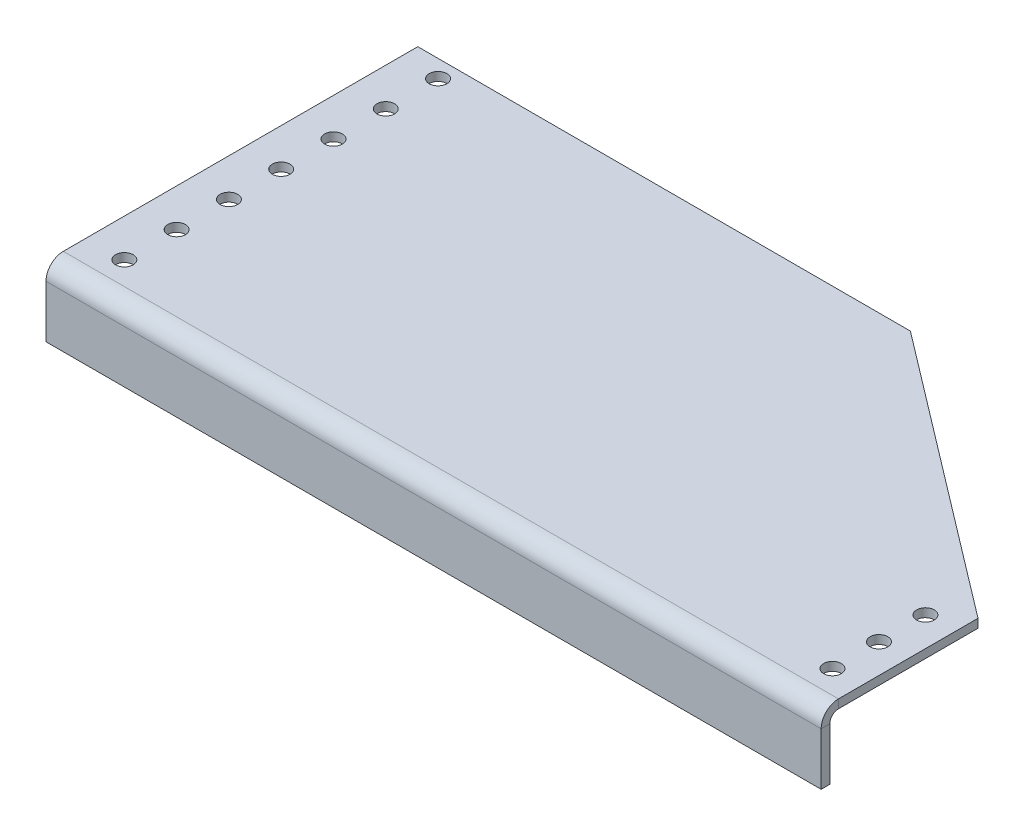
ISO-10303-21;
HEADER;
FILE_DESCRIPTION(('STEP AP214'),'2;1');
FILE_NAME('part.step','',(''),(''),'','','');
FILE_SCHEMA(('AUTOMOTIVE_DESIGN { 1 0 10303 214 1 1 1 1 }'));
ENDSEC;
DATA;
#1=APPLICATION_CONTEXT('core data for automotive mechanical design processes');
#2=APPLICATION_PROTOCOL_DEFINITION('international standard','automotive_design',2000,#1);
#3=PRODUCT_CONTEXT('',#1,'mechanical');
#4=PRODUCT('Part','Part','',(#3));
#5=PRODUCT_RELATED_PRODUCT_CATEGORY('part','',(#4));
#6=PRODUCT_DEFINITION_FORMATION('','',#4);
#7=PRODUCT_DEFINITION_CONTEXT('part definition',#1,'design');
#8=PRODUCT_DEFINITION('design','',#6,#7);
#9=PRODUCT_DEFINITION_SHAPE('','',#8);
#10=(LENGTH_UNIT() NAMED_UNIT(*) SI_UNIT(.MILLI.,.METRE.));
#11=(NAMED_UNIT(*) PLANE_ANGLE_UNIT() SI_UNIT($,.RADIAN.));
#12=(NAMED_UNIT(*) SI_UNIT($,.STERADIAN.) SOLID_ANGLE_UNIT());
#13=UNCERTAINTY_MEASURE_WITH_UNIT(LENGTH_MEASURE(1.E-05),#10,'distance_accuracy_value','');
#14=(GEOMETRIC_REPRESENTATION_CONTEXT(3) GLOBAL_UNCERTAINTY_ASSIGNED_CONTEXT((#13)) GLOBAL_UNIT_ASSIGNED_CONTEXT((#10,
#11,#12)) REPRESENTATION_CONTEXT('',''));
#15=CARTESIAN_POINT('',(0.,0.,0.));
#16=DIRECTION('',(0.,0.,1.));
#17=DIRECTION('',(1.,0.,0.));
#18=AXIS2_PLACEMENT_3D('',#15,#16,#17);
#19=CARTESIAN_POINT('',(-105.918,-2.3622,87.757));
#20=DIRECTION('',(-1.,0.,0.));
#21=DIRECTION('',(0.,0.,1.));
#22=AXIS2_PLACEMENT_3D('',#19,#20,#21);
#23=PLANE('',#22);
#24=DIRECTION('',(0.,0.,1.));
#25=VECTOR('',#24,1.);
#26=CARTESIAN_POINT('',(-105.918,0.,87.757));
#27=LINE('',#26,#25);
#28=CARTESIAN_POINT('',(-105.918,0.,-11.4808000000001));
#29=VERTEX_POINT('',#28);
#30=CARTESIAN_POINT('',(-105.918,0.,85.397));
#31=VERTEX_POINT('',#30);
#32=EDGE_CURVE('E193',#29,#31,#27,.T.);
#33=ORIENTED_EDGE('',*,*,#32,.F.);
#34=DIRECTION('',(0.,-1.,0.));
#35=VECTOR('',#34,1.);
#36=CARTESIAN_POINT('',(-105.918,0.,-11.4808000000001));
#37=LINE('',#36,#35);
#38=CARTESIAN_POINT('',(-105.918,-2.3622,-11.4808000000001));
#39=VERTEX_POINT('',#38);
#40=EDGE_CURVE('E121',#29,#39,#37,.T.);
#41=ORIENTED_EDGE('',*,*,#40,.T.);
#42=DIRECTION('',(0.,0.,1.));
#43=VECTOR('',#42,1.);
#44=CARTESIAN_POINT('',(-105.918,-2.3622,87.757));
#45=LINE('',#44,#43);
#46=CARTESIAN_POINT('',(-105.918,-2.36219999999999,85.397));
#47=VERTEX_POINT('',#46);
#48=EDGE_CURVE('E51',#39,#47,#45,.T.);
#49=ORIENTED_EDGE('',*,*,#48,.T.);
#50=DIRECTION('',(0.,1.,0.));
#51=VECTOR('',#50,1.);
#52=CARTESIAN_POINT('',(-105.918,-2.36219999999999,85.397));
#53=LINE('',#52,#51);
#54=EDGE_CURVE('E181',#47,#31,#53,.T.);
#55=ORIENTED_EDGE('',*,*,#54,.T.);
#56=EDGE_LOOP('',(#33,#41,#49,#55));
#57=FACE_BOUND('',#56,.T.);
#58=ADVANCED_FACE('F43',(#57),#23,.T.);
#59=CARTESIAN_POINT('',(0.,-2.3622,0.));
#60=DIRECTION('',(0.,1.,0.));
#61=DIRECTION('',(0.,0.,1.));
#62=AXIS2_PLACEMENT_3D('',#59,#60,#61);
#63=PLANE('',#62);
#64=CARTESIAN_POINT('',(-95.5801999999981,-2.3622,79.0469999999999));
#65=DIRECTION('',(0.,-1.,0.));
#66=DIRECTION('',(0.,0.,-1.));
#67=AXIS2_PLACEMENT_3D('',#64,#65,#66);
#68=CIRCLE('',#67,2.41299999999999);
#69=CARTESIAN_POINT('',(-95.5801999999981,-2.3622,76.6339999999999));
#70=VERTEX_POINT('',#69);
#71=EDGE_CURVE('E313',#70,#70,#68,.T.);
#72=ORIENTED_EDGE('',*,*,#71,.F.);
#73=EDGE_LOOP('',(#72));
#74=FACE_BOUND('',#73,.T.);
#75=CARTESIAN_POINT('',(-95.580199999998,-2.3622,64.7594999999999));
#76=DIRECTION('',(0.,-1.,0.));
#77=DIRECTION('',(0.,0.,-1.));
#78=AXIS2_PLACEMENT_3D('',#75,#76,#77);
#79=CIRCLE('',#78,2.41299999999999);
#80=CARTESIAN_POINT('',(-95.580199999998,-2.3622,62.3464999999999));
#81=VERTEX_POINT('',#80);
#82=EDGE_CURVE('E314',#81,#81,#79,.T.);
#83=ORIENTED_EDGE('',*,*,#82,.F.);
#84=EDGE_LOOP('',(#83));
#85=FACE_BOUND('',#84,.T.);
#86=CARTESIAN_POINT('',(-95.5801999999978,-2.3622,50.4719999999999));
#87=DIRECTION('',(0.,-1.,0.));
#88=DIRECTION('',(0.,0.,-1.));
#89=AXIS2_PLACEMENT_3D('',#86,#87,#88);
#90=CIRCLE('',#89,2.41299999999999);
#91=CARTESIAN_POINT('',(-95.5801999999978,-2.3622,48.0589999999999));
#92=VERTEX_POINT('',#91);
#93=EDGE_CURVE('E323',#92,#92,#90,.T.);
#94=ORIENTED_EDGE('',*,*,#93,.F.);
#95=EDGE_LOOP('',(#94));
#96=FACE_BOUND('',#95,.T.);
#97=CARTESIAN_POINT('',(-95.5801999999977,-2.3622,36.1845));
#98=DIRECTION('',(0.,-1.,0.));
#99=DIRECTION('',(0.,0.,-1.));
#100=AXIS2_PLACEMENT_3D('',#97,#98,#99);
#101=CIRCLE('',#100,2.41299999999999);
#102=CARTESIAN_POINT('',(-95.5801999999977,-2.3622,33.7715));
#103=VERTEX_POINT('',#102);
#104=EDGE_CURVE('E329',#103,#103,#101,.T.);
#105=ORIENTED_EDGE('',*,*,#104,.F.);
#106=EDGE_LOOP('',(#105));
#107=FACE_BOUND('',#106,.T.);
#108=CARTESIAN_POINT('',(-95.5801999999975,-2.3622,21.8969999999999));
#109=DIRECTION('',(0.,-1.,0.));
#110=DIRECTION('',(0.,0.,-1.));
#111=AXIS2_PLACEMENT_3D('',#108,#109,#110);
#112=CIRCLE('',#111,2.413);
#113=CARTESIAN_POINT('',(-95.5801999999975,-2.3622,19.4839999999999));
#114=VERTEX_POINT('',#113);
#115=EDGE_CURVE('E335',#114,#114,#112,.T.);
#116=ORIENTED_EDGE('',*,*,#115,.F.);
#117=EDGE_LOOP('',(#116));
#118=FACE_BOUND('',#117,.T.);
#119=CARTESIAN_POINT('',(-95.5801999999974,-2.3622,7.60949999999994));
#120=DIRECTION('',(0.,-1.,0.));
#121=DIRECTION('',(0.,0.,-1.));
#122=AXIS2_PLACEMENT_3D('',#119,#120,#121);
#123=CIRCLE('',#122,2.41299999999999);
#124=CARTESIAN_POINT('',(-95.5801999999974,-2.3622,5.19649999999994));
#125=VERTEX_POINT('',#124);
#126=EDGE_CURVE('E341',#125,#125,#123,.T.);
#127=ORIENTED_EDGE('',*,*,#126,.F.);
#128=EDGE_LOOP('',(#127));
#129=FACE_BOUND('',#128,.T.);
#130=CARTESIAN_POINT('',(-95.5801999999972,-2.3622,-6.67800000000007));
#131=DIRECTION('',(0.,-1.,0.));
#132=DIRECTION('',(0.,0.,-1.));
#133=AXIS2_PLACEMENT_3D('',#130,#131,#132);
#134=CIRCLE('',#133,2.413);
#135=CARTESIAN_POINT('',(-95.5801999999972,-2.3622,-9.09100000000007));
#136=VERTEX_POINT('',#135);
#137=EDGE_CURVE('E347',#136,#136,#134,.T.);
#138=ORIENTED_EDGE('',*,*,#137,.F.);
#139=EDGE_LOOP('',(#138));
#140=FACE_BOUND('',#139,.T.);
#141=CARTESIAN_POINT('',(97.9402000000013,-2.3622,79.0469999999996));
#142=DIRECTION('',(0.,-1.,0.));
#143=DIRECTION('',(0.,0.,-1.));
#144=AXIS2_PLACEMENT_3D('',#141,#142,#143);
#145=CIRCLE('',#144,2.41299999999999);
#146=CARTESIAN_POINT('',(97.9402000000013,-2.3622,76.6339999999996));
#147=VERTEX_POINT('',#146);
#148=EDGE_CURVE('E355',#147,#147,#145,.T.);
#149=ORIENTED_EDGE('',*,*,#148,.F.);
#150=EDGE_LOOP('',(#149));
#151=FACE_BOUND('',#150,.T.);
#152=CARTESIAN_POINT('',(97.9402000000013,-2.3622,66.3469999999995));
#153=DIRECTION('',(0.,-1.,0.));
#154=DIRECTION('',(0.,0.,-1.));
#155=AXIS2_PLACEMENT_3D('',#152,#153,#154);
#156=CIRCLE('',#155,2.41299999999999);
#157=CARTESIAN_POINT('',(97.9402000000013,-2.3622,63.9339999999995));
#158=VERTEX_POINT('',#157);
#159=EDGE_CURVE('E358',#158,#158,#156,.T.);
#160=ORIENTED_EDGE('',*,*,#159,.F.);
#161=EDGE_LOOP('',(#160));
#162=FACE_BOUND('',#161,.T.);
#163=CARTESIAN_POINT('',(97.9402000000013,-2.3622,53.6469999999993));
#164=DIRECTION('',(0.,-1.,0.));
#165=DIRECTION('',(0.,0.,-1.));
#166=AXIS2_PLACEMENT_3D('',#163,#164,#165);
#167=CIRCLE('',#166,2.41299999999999);
#168=CARTESIAN_POINT('',(97.9402000000013,-2.3622,51.2339999999993));
#169=VERTEX_POINT('',#168);
#170=EDGE_CURVE('E363',#169,#169,#167,.T.);
#171=ORIENTED_EDGE('',*,*,#170,.F.);
#172=EDGE_LOOP('',(#171));
#173=FACE_BOUND('',#172,.T.);
#174=DIRECTION('',(0.795897255995404,0.,0.605431712003084));
#175=VECTOR('',#174,1.);
#176=CARTESIAN_POINT('',(16.0528028073742,-2.3622,-21.102927798667));
#177=LINE('',#176,#175);
#178=CARTESIAN_POINT('',(28.702,-2.3622,-11.4808000000001));
#179=VERTEX_POINT('',#178);
#180=CARTESIAN_POINT('',(105.918,-2.3622,47.2567000000001));
#181=VERTEX_POINT('',#180);
#182=EDGE_CURVE('E127',#179,#181,#177,.T.);
#183=ORIENTED_EDGE('',*,*,#182,.T.);
#184=DIRECTION('',(0.,0.,-1.));
#185=VECTOR('',#184,1.);
#186=CARTESIAN_POINT('',(105.918,-2.3622,87.757));
#187=LINE('',#186,#185);
#188=CARTESIAN_POINT('',(105.918,-2.36219999999999,85.397));
#189=VERTEX_POINT('',#188);
#190=EDGE_CURVE('E11',#189,#181,#187,.T.);
#191=ORIENTED_EDGE('',*,*,#190,.F.);
#192=DIRECTION('',(-1.,0.,0.));
#193=VECTOR('',#192,1.);
#194=CARTESIAN_POINT('',(-105.918,-2.36219999999999,85.397));
#195=LINE('',#194,#193);
#196=EDGE_CURVE('E187',#47,#189,#195,.F.);
#197=ORIENTED_EDGE('',*,*,#196,.F.);
#198=ORIENTED_EDGE('',*,*,#48,.F.);
#199=DIRECTION('',(1.,0.,0.));
#200=VECTOR('',#199,1.);
#201=CARTESIAN_POINT('',(0.,-2.3622,-11.4808000000001));
#202=LINE('',#201,#200);
#203=EDGE_CURVE('E134',#39,#179,#202,.T.);
#204=ORIENTED_EDGE('',*,*,#203,.T.);
#205=EDGE_LOOP('',(#183,#191,#197,#198,#204));
#206=FACE_BOUND('',#205,.T.);
#207=ADVANCED_FACE('F207',(#74,#85,#96,#107,#118,#129,#140,#151,#162,#173,#206),#63,.F.);
#208=CARTESIAN_POINT('',(0.,0.,0.));
#209=DIRECTION('',(0.,1.,0.));
#210=DIRECTION('',(0.,0.,1.));
#211=AXIS2_PLACEMENT_3D('',#208,#209,#210);
#212=PLANE('',#211);
#213=CARTESIAN_POINT('',(-95.5801999999981,0.,79.0469999999999));
#214=DIRECTION('',(0.,-1.,0.));
#215=DIRECTION('',(0.,0.,-1.));
#216=AXIS2_PLACEMENT_3D('',#213,#214,#215);
#217=CIRCLE('',#216,2.41299999999999);
#218=CARTESIAN_POINT('',(-95.5801999999981,0.,76.6339999999999));
#219=VERTEX_POINT('',#218);
#220=EDGE_CURVE('E311',#219,#219,#217,.T.);
#221=ORIENTED_EDGE('',*,*,#220,.T.);
#222=EDGE_LOOP('',(#221));
#223=FACE_BOUND('',#222,.T.);
#224=CARTESIAN_POINT('',(-95.580199999998,0.,64.7594999999999));
#225=DIRECTION('',(0.,-1.,0.));
#226=DIRECTION('',(0.,0.,-1.));
#227=AXIS2_PLACEMENT_3D('',#224,#225,#226);
#228=CIRCLE('',#227,2.41299999999999);
#229=CARTESIAN_POINT('',(-95.580199999998,0.,62.3464999999999));
#230=VERTEX_POINT('',#229);
#231=EDGE_CURVE('E318',#230,#230,#228,.T.);
#232=ORIENTED_EDGE('',*,*,#231,.T.);
#233=EDGE_LOOP('',(#232));
#234=FACE_BOUND('',#233,.T.);
#235=CARTESIAN_POINT('',(-95.5801999999978,0.,50.4719999999999));
#236=DIRECTION('',(0.,-1.,0.));
#237=DIRECTION('',(0.,0.,-1.));
#238=AXIS2_PLACEMENT_3D('',#235,#236,#237);
#239=CIRCLE('',#238,2.41299999999999);
#240=CARTESIAN_POINT('',(-95.5801999999978,0.,48.0589999999999));
#241=VERTEX_POINT('',#240);
#242=EDGE_CURVE('E326',#241,#241,#239,.T.);
#243=ORIENTED_EDGE('',*,*,#242,.T.);
#244=EDGE_LOOP('',(#243));
#245=FACE_BOUND('',#244,.T.);
#246=CARTESIAN_POINT('',(-95.5801999999977,0.,36.1845));
#247=DIRECTION('',(0.,-1.,0.));
#248=DIRECTION('',(0.,0.,-1.));
#249=AXIS2_PLACEMENT_3D('',#246,#247,#248);
#250=CIRCLE('',#249,2.41299999999999);
#251=CARTESIAN_POINT('',(-95.5801999999977,0.,33.7715));
#252=VERTEX_POINT('',#251);
#253=EDGE_CURVE('E332',#252,#252,#250,.T.);
#254=ORIENTED_EDGE('',*,*,#253,.T.);
#255=EDGE_LOOP('',(#254));
#256=FACE_BOUND('',#255,.T.);
#257=CARTESIAN_POINT('',(-95.5801999999975,0.,21.8969999999999));
#258=DIRECTION('',(0.,-1.,0.));
#259=DIRECTION('',(0.,0.,-1.));
#260=AXIS2_PLACEMENT_3D('',#257,#258,#259);
#261=CIRCLE('',#260,2.413);
#262=CARTESIAN_POINT('',(-95.5801999999975,0.,19.4839999999999));
#263=VERTEX_POINT('',#262);
#264=EDGE_CURVE('E338',#263,#263,#261,.T.);
#265=ORIENTED_EDGE('',*,*,#264,.T.);
#266=EDGE_LOOP('',(#265));
#267=FACE_BOUND('',#266,.T.);
#268=CARTESIAN_POINT('',(-95.5801999999974,0.,7.60949999999994));
#269=DIRECTION('',(0.,-1.,0.));
#270=DIRECTION('',(0.,0.,-1.));
#271=AXIS2_PLACEMENT_3D('',#268,#269,#270);
#272=CIRCLE('',#271,2.41299999999999);
#273=CARTESIAN_POINT('',(-95.5801999999974,0.,5.19649999999994));
#274=VERTEX_POINT('',#273);
#275=EDGE_CURVE('E344',#274,#274,#272,.T.);
#276=ORIENTED_EDGE('',*,*,#275,.T.);
#277=EDGE_LOOP('',(#276));
#278=FACE_BOUND('',#277,.T.);
#279=CARTESIAN_POINT('',(-95.5801999999972,0.,-6.67800000000007));
#280=DIRECTION('',(0.,-1.,0.));
#281=DIRECTION('',(0.,0.,-1.));
#282=AXIS2_PLACEMENT_3D('',#279,#280,#281);
#283=CIRCLE('',#282,2.413);
#284=CARTESIAN_POINT('',(-95.5801999999972,0.,-9.09100000000007));
#285=VERTEX_POINT('',#284);
#286=EDGE_CURVE('E350',#285,#285,#283,.T.);
#287=ORIENTED_EDGE('',*,*,#286,.T.);
#288=EDGE_LOOP('',(#287));
#289=FACE_BOUND('',#288,.T.);
#290=CARTESIAN_POINT('',(97.9402000000013,0.,79.0469999999996));
#291=DIRECTION('',(0.,-1.,0.));
#292=DIRECTION('',(0.,0.,-1.));
#293=AXIS2_PLACEMENT_3D('',#290,#291,#292);
#294=CIRCLE('',#293,2.41299999999999);
#295=CARTESIAN_POINT('',(97.9402000000013,0.,76.6339999999996));
#296=VERTEX_POINT('',#295);
#297=EDGE_CURVE('E141',#296,#296,#294,.T.);
#298=ORIENTED_EDGE('',*,*,#297,.T.);
#299=EDGE_LOOP('',(#298));
#300=FACE_BOUND('',#299,.T.);
#301=CARTESIAN_POINT('',(97.9402000000013,0.,66.3469999999995));
#302=DIRECTION('',(0.,-1.,0.));
#303=DIRECTION('',(0.,0.,-1.));
#304=AXIS2_PLACEMENT_3D('',#301,#302,#303);
#305=CIRCLE('',#304,2.41299999999999);
#306=CARTESIAN_POINT('',(97.9402000000013,0.,63.9339999999995));
#307=VERTEX_POINT('',#306);
#308=EDGE_CURVE('E361',#307,#307,#305,.T.);
#309=ORIENTED_EDGE('',*,*,#308,.T.);
#310=EDGE_LOOP('',(#309));
#311=FACE_BOUND('',#310,.T.);
#312=CARTESIAN_POINT('',(97.9402000000013,0.,53.6469999999993));
#313=DIRECTION('',(0.,-1.,0.));
#314=DIRECTION('',(0.,0.,-1.));
#315=AXIS2_PLACEMENT_3D('',#312,#313,#314);
#316=CIRCLE('',#315,2.41299999999999);
#317=CARTESIAN_POINT('',(97.9402000000013,0.,51.2339999999993));
#318=VERTEX_POINT('',#317);
#319=EDGE_CURVE('E138',#318,#318,#316,.T.);
#320=ORIENTED_EDGE('',*,*,#319,.T.);
#321=EDGE_LOOP('',(#320));
#322=FACE_BOUND('',#321,.T.);
#323=DIRECTION('',(0.,0.,-1.));
#324=VECTOR('',#323,1.);
#325=CARTESIAN_POINT('',(105.918,0.,87.757));
#326=LINE('',#325,#324);
#327=CARTESIAN_POINT('',(105.918,0.,85.397));
#328=VERTEX_POINT('',#327);
#329=CARTESIAN_POINT('',(105.918,0.,47.2567000000001));
#330=VERTEX_POINT('',#329);
#331=EDGE_CURVE('E46',#328,#330,#326,.T.);
#332=ORIENTED_EDGE('',*,*,#331,.T.);
#333=DIRECTION('',(0.795897255995404,0.,0.605431712003084));
#334=VECTOR('',#333,1.);
#335=CARTESIAN_POINT('',(16.0528028073742,0.,-21.102927798667));
#336=LINE('',#335,#334);
#337=CARTESIAN_POINT('',(28.702,0.,-11.4808000000001));
#338=VERTEX_POINT('',#337);
#339=EDGE_CURVE('E59',#338,#330,#336,.T.);
#340=ORIENTED_EDGE('',*,*,#339,.F.);
#341=DIRECTION('',(1.,0.,0.));
#342=VECTOR('',#341,1.);
#343=CARTESIAN_POINT('',(0.,0.,-11.4808000000001));
#344=LINE('',#343,#342);
#345=EDGE_CURVE('E116',#29,#338,#344,.T.);
#346=ORIENTED_EDGE('',*,*,#345,.F.);
#347=ORIENTED_EDGE('',*,*,#32,.T.);
#348=DIRECTION('',(-1.,0.,0.));
#349=VECTOR('',#348,1.);
#350=CARTESIAN_POINT('',(-105.918,0.,85.397));
#351=LINE('',#350,#349);
#352=EDGE_CURVE('E177',#31,#328,#351,.F.);
#353=ORIENTED_EDGE('',*,*,#352,.T.);
#354=EDGE_LOOP('',(#332,#340,#346,#347,#353));
#355=FACE_BOUND('',#354,.T.);
#356=ADVANCED_FACE('F131',(#223,#234,#245,#256,#267,#278,#289,#300,#311,#322,#355),#212,.T.);
#357=CARTESIAN_POINT('',(105.918,-2.3622,87.757));
#358=DIRECTION('',(1.,0.,0.));
#359=DIRECTION('',(0.,0.,-1.));
#360=AXIS2_PLACEMENT_3D('',#357,#358,#359);
#361=PLANE('',#360);
#362=ORIENTED_EDGE('',*,*,#190,.T.);
#363=DIRECTION('',(0.,-1.,0.));
#364=VECTOR('',#363,1.);
#365=CARTESIAN_POINT('',(105.918,0.,47.2567000000001));
#366=LINE('',#365,#364);
#367=EDGE_CURVE('E143',#330,#181,#366,.T.);
#368=ORIENTED_EDGE('',*,*,#367,.F.);
#369=ORIENTED_EDGE('',*,*,#331,.F.);
#370=DIRECTION('',(0.,1.,0.));
#371=VECTOR('',#370,1.);
#372=CARTESIAN_POINT('',(105.918,-2.36219999999999,85.397));
#373=LINE('',#372,#371);
#374=EDGE_CURVE('E191',#189,#328,#373,.T.);
#375=ORIENTED_EDGE('',*,*,#374,.F.);
#376=EDGE_LOOP('',(#362,#368,#369,#375));
#377=FACE_BOUND('',#376,.T.);
#378=ADVANCED_FACE('F217',(#377),#361,.T.);
#379=CARTESIAN_POINT('',(105.918,-4.72219999999998,85.397));
#380=DIRECTION('',(1.,0.,0.));
#381=DIRECTION('',(0.,0.,-1.));
#382=AXIS2_PLACEMENT_3D('',#379,#380,#381);
#383=PLANE('',#382);
#384=DIRECTION('',(0.,0.,1.));
#385=VECTOR('',#384,1.);
#386=CARTESIAN_POINT('',(105.918,-4.72219999999998,87.757));
#387=LINE('',#386,#385);
#388=CARTESIAN_POINT('',(105.918,-4.72219999999997,87.757));
#389=VERTEX_POINT('',#388);
#390=CARTESIAN_POINT('',(105.918,-4.72219999999997,90.1192));
#391=VERTEX_POINT('',#390);
#392=EDGE_CURVE('E145',#389,#391,#387,.T.);
#393=ORIENTED_EDGE('',*,*,#392,.F.);
#394=CARTESIAN_POINT('',(105.918,-4.72219999999998,85.397));
#395=DIRECTION('',(-1.,0.,0.));
#396=DIRECTION('',(0.,0.,1.));
#397=AXIS2_PLACEMENT_3D('',#394,#395,#396);
#398=CIRCLE('',#397,2.35999999999999);
#399=EDGE_CURVE('E184',#189,#389,#398,.F.);
#400=ORIENTED_EDGE('',*,*,#399,.F.);
#401=ORIENTED_EDGE('',*,*,#374,.T.);
#402=CARTESIAN_POINT('',(105.918,-4.72219999999998,85.397));
#403=DIRECTION('',(-1.,0.,0.));
#404=DIRECTION('',(0.,0.,1.));
#405=AXIS2_PLACEMENT_3D('',#402,#403,#404);
#406=CIRCLE('',#405,4.72219999999999);
#407=EDGE_CURVE('E67',#328,#391,#406,.F.);
#408=ORIENTED_EDGE('',*,*,#407,.T.);
#409=EDGE_LOOP('',(#393,#400,#401,#408));
#410=FACE_BOUND('',#409,.T.);
#411=ADVANCED_FACE('F215',(#410),#383,.T.);
#412=CARTESIAN_POINT('',(-105.918,-4.72219999999998,85.397));
#413=DIRECTION('',(1.,0.,0.));
#414=DIRECTION('',(0.,0.,-1.));
#415=AXIS2_PLACEMENT_3D('',#412,#413,#414);
#416=PLANE('',#415);
#417=CARTESIAN_POINT('',(-105.918,-4.72219999999998,85.397));
#418=DIRECTION('',(-1.,0.,0.));
#419=DIRECTION('',(0.,0.,1.));
#420=AXIS2_PLACEMENT_3D('',#417,#418,#419);
#421=CIRCLE('',#420,2.35999999999999);
#422=CARTESIAN_POINT('',(-105.918,-4.72219999999997,87.757));
#423=VERTEX_POINT('',#422);
#424=EDGE_CURVE('E176',#423,#47,#421,.T.);
#425=ORIENTED_EDGE('',*,*,#424,.F.);
#426=DIRECTION('',(0.,0.,1.));
#427=VECTOR('',#426,1.);
#428=CARTESIAN_POINT('',(-105.918,-4.72219999999998,87.757));
#429=LINE('',#428,#427);
#430=CARTESIAN_POINT('',(-105.918,-4.72219999999998,90.1192));
#431=VERTEX_POINT('',#430);
#432=EDGE_CURVE('E149',#423,#431,#429,.T.);
#433=ORIENTED_EDGE('',*,*,#432,.T.);
#434=CARTESIAN_POINT('',(-105.918,-4.72219999999998,85.397));
#435=DIRECTION('',(-1.,0.,0.));
#436=DIRECTION('',(0.,0.,1.));
#437=AXIS2_PLACEMENT_3D('',#434,#435,#436);
#438=CIRCLE('',#437,4.72219999999999);
#439=EDGE_CURVE('E179',#431,#31,#438,.T.);
#440=ORIENTED_EDGE('',*,*,#439,.T.);
#441=ORIENTED_EDGE('',*,*,#54,.F.);
#442=EDGE_LOOP('',(#425,#433,#440,#441));
#443=FACE_BOUND('',#442,.T.);
#444=ADVANCED_FACE('F201',(#443),#416,.F.);
#445=CARTESIAN_POINT('',(-105.918,-4.72219999999998,85.397));
#446=DIRECTION('',(-1.,0.,0.));
#447=DIRECTION('',(0.,0.,1.));
#448=AXIS2_PLACEMENT_3D('',#445,#446,#447);
#449=CYLINDRICAL_SURFACE('',#448,4.72219999999999);
#450=ORIENTED_EDGE('',*,*,#352,.F.);
#451=ORIENTED_EDGE('',*,*,#439,.F.);
#452=DIRECTION('',(1.,0.,0.));
#453=VECTOR('',#452,1.);
#454=CARTESIAN_POINT('',(0.,-4.72219999999998,90.1192));
#455=LINE('',#454,#453);
#456=EDGE_CURVE('E152',#431,#391,#455,.T.);
#457=ORIENTED_EDGE('',*,*,#456,.T.);
#458=ORIENTED_EDGE('',*,*,#407,.F.);
#459=EDGE_LOOP('',(#450,#451,#457,#458));
#460=FACE_BOUND('',#459,.T.);
#461=ADVANCED_FACE('F197',(#460),#449,.T.);
#462=CARTESIAN_POINT('',(-105.918,-4.72219999999998,85.397));
#463=DIRECTION('',(-1.,0.,0.));
#464=DIRECTION('',(0.,0.,1.));
#465=AXIS2_PLACEMENT_3D('',#462,#463,#464);
#466=CYLINDRICAL_SURFACE('',#465,2.35999999999999);
#467=ORIENTED_EDGE('',*,*,#196,.T.);
#468=ORIENTED_EDGE('',*,*,#399,.T.);
#469=DIRECTION('',(-1.,0.,0.));
#470=VECTOR('',#469,1.);
#471=CARTESIAN_POINT('',(105.918,-4.72219999999998,87.757));
#472=LINE('',#471,#470);
#473=EDGE_CURVE('E147',#389,#423,#472,.T.);
#474=ORIENTED_EDGE('',*,*,#473,.T.);
#475=ORIENTED_EDGE('',*,*,#424,.T.);
#476=EDGE_LOOP('',(#467,#468,#474,#475));
#477=FACE_BOUND('',#476,.T.);
#478=ADVANCED_FACE('F211',(#477),#466,.F.);
#479=CARTESIAN_POINT('',(-105.918,-19.05,90.1192));
#480=DIRECTION('',(1.,0.,0.));
#481=DIRECTION('',(0.,0.,-1.));
#482=AXIS2_PLACEMENT_3D('',#479,#480,#481);
#483=PLANE('',#482);
#484=ORIENTED_EDGE('',*,*,#432,.F.);
#485=DIRECTION('',(0.,-1.,0.));
#486=VECTOR('',#485,1.);
#487=CARTESIAN_POINT('',(-105.918,-19.05,87.7570000000001));
#488=LINE('',#487,#486);
#489=CARTESIAN_POINT('',(-105.918,-19.05,87.7570000000001));
#490=VERTEX_POINT('',#489);
#491=EDGE_CURVE('E156',#423,#490,#488,.T.);
#492=ORIENTED_EDGE('',*,*,#491,.T.);
#493=DIRECTION('',(0.,0.,-1.));
#494=VECTOR('',#493,1.);
#495=CARTESIAN_POINT('',(-105.918,-19.05,90.1192));
#496=LINE('',#495,#494);
#497=CARTESIAN_POINT('',(-105.918,-19.05,90.1192));
#498=VERTEX_POINT('',#497);
#499=EDGE_CURVE('E173',#498,#490,#496,.T.);
#500=ORIENTED_EDGE('',*,*,#499,.F.);
#501=DIRECTION('',(0.,-1.,0.));
#502=VECTOR('',#501,1.);
#503=CARTESIAN_POINT('',(-105.918,-19.05,90.1192));
#504=LINE('',#503,#502);
#505=EDGE_CURVE('E157',#431,#498,#504,.T.);
#506=ORIENTED_EDGE('',*,*,#505,.F.);
#507=EDGE_LOOP('',(#484,#492,#500,#506));
#508=FACE_BOUND('',#507,.T.);
#509=ADVANCED_FACE('F244',(#508),#483,.F.);
#510=CARTESIAN_POINT('',(105.918,-2.36219999999999,90.1192));
#511=DIRECTION('',(-1.,0.,0.));
#512=DIRECTION('',(0.,0.,1.));
#513=AXIS2_PLACEMENT_3D('',#510,#511,#512);
#514=PLANE('',#513);
#515=ORIENTED_EDGE('',*,*,#392,.T.);
#516=DIRECTION('',(0.,1.,0.));
#517=VECTOR('',#516,1.);
#518=CARTESIAN_POINT('',(105.918,-2.36219999999999,90.1192));
#519=LINE('',#518,#517);
#520=CARTESIAN_POINT('',(105.918,-19.05,90.1192));
#521=VERTEX_POINT('',#520);
#522=EDGE_CURVE('E162',#521,#391,#519,.T.);
#523=ORIENTED_EDGE('',*,*,#522,.F.);
#524=DIRECTION('',(0.,0.,-1.));
#525=VECTOR('',#524,1.);
#526=CARTESIAN_POINT('',(105.918,-19.05,90.1192));
#527=LINE('',#526,#525);
#528=CARTESIAN_POINT('',(105.918,-19.05,87.757));
#529=VERTEX_POINT('',#528);
#530=EDGE_CURVE('E165',#521,#529,#527,.T.);
#531=ORIENTED_EDGE('',*,*,#530,.T.);
#532=DIRECTION('',(0.,1.,0.));
#533=VECTOR('',#532,1.);
#534=CARTESIAN_POINT('',(105.918,-2.3622,87.757));
#535=LINE('',#534,#533);
#536=EDGE_CURVE('E160',#529,#389,#535,.T.);
#537=ORIENTED_EDGE('',*,*,#536,.T.);
#538=EDGE_LOOP('',(#515,#523,#531,#537));
#539=FACE_BOUND('',#538,.T.);
#540=ADVANCED_FACE('F249',(#539),#514,.F.);
#541=CARTESIAN_POINT('',(0.,3.00166949370816E-13,90.1192));
#542=DIRECTION('',(0.,0.,-1.));
#543=DIRECTION('',(0.,1.,0.));
#544=AXIS2_PLACEMENT_3D('',#541,#542,#543);
#545=PLANE('',#544);
#546=ORIENTED_EDGE('',*,*,#456,.F.);
#547=ORIENTED_EDGE('',*,*,#505,.T.);
#548=DIRECTION('',(1.,0.,0.));
#549=VECTOR('',#548,1.);
#550=CARTESIAN_POINT('',(105.918,-19.05,90.1192));
#551=LINE('',#550,#549);
#552=EDGE_CURVE('E159',#498,#521,#551,.T.);
#553=ORIENTED_EDGE('',*,*,#552,.T.);
#554=ORIENTED_EDGE('',*,*,#522,.T.);
#555=EDGE_LOOP('',(#546,#547,#553,#554));
#556=FACE_BOUND('',#555,.T.);
#557=ADVANCED_FACE('F257',(#556),#545,.F.);
#558=CARTESIAN_POINT('',(0.,2.919193721522E-13,87.757));
#559=DIRECTION('',(0.,0.,-1.));
#560=DIRECTION('',(0.,1.,0.));
#561=AXIS2_PLACEMENT_3D('',#558,#559,#560);
#562=PLANE('',#561);
#563=ORIENTED_EDGE('',*,*,#491,.F.);
#564=ORIENTED_EDGE('',*,*,#473,.F.);
#565=ORIENTED_EDGE('',*,*,#536,.F.);
#566=DIRECTION('',(1.,0.,0.));
#567=VECTOR('',#566,1.);
#568=CARTESIAN_POINT('',(105.918,-19.05,87.757));
#569=LINE('',#568,#567);
#570=EDGE_CURVE('E167',#490,#529,#569,.T.);
#571=ORIENTED_EDGE('',*,*,#570,.F.);
#572=EDGE_LOOP('',(#563,#564,#565,#571));
#573=FACE_BOUND('',#572,.T.);
#574=ADVANCED_FACE('F253',(#573),#562,.T.);
#575=CARTESIAN_POINT('',(105.918,-19.05,90.1192));
#576=DIRECTION('',(0.,1.,0.));
#577=DIRECTION('',(0.,0.,1.));
#578=AXIS2_PLACEMENT_3D('',#575,#576,#577);
#579=PLANE('',#578);
#580=ORIENTED_EDGE('',*,*,#570,.T.);
#581=ORIENTED_EDGE('',*,*,#530,.F.);
#582=ORIENTED_EDGE('',*,*,#552,.F.);
#583=ORIENTED_EDGE('',*,*,#499,.T.);
#584=EDGE_LOOP('',(#580,#581,#582,#583));
#585=FACE_BOUND('',#584,.T.);
#586=ADVANCED_FACE('F251',(#585),#579,.F.);
#587=CARTESIAN_POINT('',(16.0528028073742,0.,-21.102927798667));
#588=DIRECTION('',(0.605431712003084,0.,-0.795897255995404));
#589=DIRECTION('',(-0.795897255995404,0.,-0.605431712003084));
#590=AXIS2_PLACEMENT_3D('',#587,#588,#589);
#591=PLANE('',#590);
#592=ORIENTED_EDGE('',*,*,#182,.F.);
#593=DIRECTION('',(0.,-1.,0.));
#594=VECTOR('',#593,1.);
#595=CARTESIAN_POINT('',(28.702,0.,-11.4808000000001));
#596=LINE('',#595,#594);
#597=EDGE_CURVE('E118',#338,#179,#596,.T.);
#598=ORIENTED_EDGE('',*,*,#597,.F.);
#599=ORIENTED_EDGE('',*,*,#339,.T.);
#600=ORIENTED_EDGE('',*,*,#367,.T.);
#601=EDGE_LOOP('',(#592,#598,#599,#600));
#602=FACE_BOUND('',#601,.T.);
#603=ADVANCED_FACE('F125',(#602),#591,.T.);
#604=CARTESIAN_POINT('',(0.,0.,-11.4808000000001));
#605=DIRECTION('',(0.,0.,-1.));
#606=DIRECTION('',(-1.,0.,0.));
#607=AXIS2_PLACEMENT_3D('',#604,#605,#606);
#608=PLANE('',#607);
#609=ORIENTED_EDGE('',*,*,#203,.F.);
#610=ORIENTED_EDGE('',*,*,#40,.F.);
#611=ORIENTED_EDGE('',*,*,#345,.T.);
#612=ORIENTED_EDGE('',*,*,#597,.T.);
#613=EDGE_LOOP('',(#609,#610,#611,#612));
#614=FACE_BOUND('',#613,.T.);
#615=ADVANCED_FACE('F117',(#614),#608,.T.);
#616=CARTESIAN_POINT('',(97.9402000000013,0.,53.6469999999993));
#617=DIRECTION('',(0.,-1.,0.));
#618=DIRECTION('',(0.,0.,-1.));
#619=AXIS2_PLACEMENT_3D('',#616,#617,#618);
#620=CYLINDRICAL_SURFACE('',#619,2.41299999999999);
#621=ORIENTED_EDGE('',*,*,#319,.F.);
#622=EDGE_LOOP('',(#621));
#623=FACE_BOUND('',#622,.T.);
#624=ORIENTED_EDGE('',*,*,#170,.T.);
#625=EDGE_LOOP('',(#624));
#626=FACE_BOUND('',#625,.T.);
#627=ADVANCED_FACE('F268',(#623,#626),#620,.F.);
#628=CARTESIAN_POINT('',(97.9402000000013,0.,66.3469999999995));
#629=DIRECTION('',(0.,-1.,0.));
#630=DIRECTION('',(0.,0.,-1.));
#631=AXIS2_PLACEMENT_3D('',#628,#629,#630);
#632=CYLINDRICAL_SURFACE('',#631,2.41299999999999);
#633=ORIENTED_EDGE('',*,*,#308,.F.);
#634=EDGE_LOOP('',(#633));
#635=FACE_BOUND('',#634,.T.);
#636=ORIENTED_EDGE('',*,*,#159,.T.);
#637=EDGE_LOOP('',(#636));
#638=FACE_BOUND('',#637,.T.);
#639=ADVANCED_FACE('F271',(#635,#638),#632,.F.);
#640=CARTESIAN_POINT('',(97.9402000000013,0.,79.0469999999996));
#641=DIRECTION('',(0.,-1.,0.));
#642=DIRECTION('',(0.,0.,-1.));
#643=AXIS2_PLACEMENT_3D('',#640,#641,#642);
#644=CYLINDRICAL_SURFACE('',#643,2.41299999999999);
#645=ORIENTED_EDGE('',*,*,#297,.F.);
#646=EDGE_LOOP('',(#645));
#647=FACE_BOUND('',#646,.T.);
#648=ORIENTED_EDGE('',*,*,#148,.T.);
#649=EDGE_LOOP('',(#648));
#650=FACE_BOUND('',#649,.T.);
#651=ADVANCED_FACE('F275',(#647,#650),#644,.F.);
#652=CARTESIAN_POINT('',(-95.5801999999972,0.,-6.67800000000007));
#653=DIRECTION('',(0.,-1.,0.));
#654=DIRECTION('',(0.,0.,-1.));
#655=AXIS2_PLACEMENT_3D('',#652,#653,#654);
#656=CYLINDRICAL_SURFACE('',#655,2.413);
#657=ORIENTED_EDGE('',*,*,#286,.F.);
#658=EDGE_LOOP('',(#657));
#659=FACE_BOUND('',#658,.T.);
#660=ORIENTED_EDGE('',*,*,#137,.T.);
#661=EDGE_LOOP('',(#660));
#662=FACE_BOUND('',#661,.T.);
#663=ADVANCED_FACE('F278',(#659,#662),#656,.F.);
#664=CARTESIAN_POINT('',(-95.5801999999974,0.,7.60949999999994));
#665=DIRECTION('',(0.,-1.,0.));
#666=DIRECTION('',(0.,0.,-1.));
#667=AXIS2_PLACEMENT_3D('',#664,#665,#666);
#668=CYLINDRICAL_SURFACE('',#667,2.41299999999999);
#669=ORIENTED_EDGE('',*,*,#275,.F.);
#670=EDGE_LOOP('',(#669));
#671=FACE_BOUND('',#670,.T.);
#672=ORIENTED_EDGE('',*,*,#126,.T.);
#673=EDGE_LOOP('',(#672));
#674=FACE_BOUND('',#673,.T.);
#675=ADVANCED_FACE('F282',(#671,#674),#668,.F.);
#676=CARTESIAN_POINT('',(-95.5801999999975,0.,21.8969999999999));
#677=DIRECTION('',(0.,-1.,0.));
#678=DIRECTION('',(0.,0.,-1.));
#679=AXIS2_PLACEMENT_3D('',#676,#677,#678);
#680=CYLINDRICAL_SURFACE('',#679,2.413);
#681=ORIENTED_EDGE('',*,*,#264,.F.);
#682=EDGE_LOOP('',(#681));
#683=FACE_BOUND('',#682,.T.);
#684=ORIENTED_EDGE('',*,*,#115,.T.);
#685=EDGE_LOOP('',(#684));
#686=FACE_BOUND('',#685,.T.);
#687=ADVANCED_FACE('F286',(#683,#686),#680,.F.);
#688=CARTESIAN_POINT('',(-95.5801999999977,0.,36.1845));
#689=DIRECTION('',(0.,-1.,0.));
#690=DIRECTION('',(0.,0.,-1.));
#691=AXIS2_PLACEMENT_3D('',#688,#689,#690);
#692=CYLINDRICAL_SURFACE('',#691,2.41299999999999);
#693=ORIENTED_EDGE('',*,*,#253,.F.);
#694=EDGE_LOOP('',(#693));
#695=FACE_BOUND('',#694,.T.);
#696=ORIENTED_EDGE('',*,*,#104,.T.);
#697=EDGE_LOOP('',(#696));
#698=FACE_BOUND('',#697,.T.);
#699=ADVANCED_FACE('F290',(#695,#698),#692,.F.);
#700=CARTESIAN_POINT('',(-95.5801999999978,0.,50.4719999999999));
#701=DIRECTION('',(0.,-1.,0.));
#702=DIRECTION('',(0.,0.,-1.));
#703=AXIS2_PLACEMENT_3D('',#700,#701,#702);
#704=CYLINDRICAL_SURFACE('',#703,2.41299999999999);
#705=ORIENTED_EDGE('',*,*,#242,.F.);
#706=EDGE_LOOP('',(#705));
#707=FACE_BOUND('',#706,.T.);
#708=ORIENTED_EDGE('',*,*,#93,.T.);
#709=EDGE_LOOP('',(#708));
#710=FACE_BOUND('',#709,.T.);
#711=ADVANCED_FACE('F294',(#707,#710),#704,.F.);
#712=CARTESIAN_POINT('',(-95.580199999998,0.,64.7594999999999));
#713=DIRECTION('',(0.,-1.,0.));
#714=DIRECTION('',(0.,0.,-1.));
#715=AXIS2_PLACEMENT_3D('',#712,#713,#714);
#716=CYLINDRICAL_SURFACE('',#715,2.41299999999999);
#717=ORIENTED_EDGE('',*,*,#231,.F.);
#718=EDGE_LOOP('',(#717));
#719=FACE_BOUND('',#718,.T.);
#720=ORIENTED_EDGE('',*,*,#82,.T.);
#721=EDGE_LOOP('',(#720));
#722=FACE_BOUND('',#721,.T.);
#723=ADVANCED_FACE('F298',(#719,#722),#716,.F.);
#724=CARTESIAN_POINT('',(-95.5801999999981,0.,79.0469999999999));
#725=DIRECTION('',(0.,-1.,0.));
#726=DIRECTION('',(0.,0.,-1.));
#727=AXIS2_PLACEMENT_3D('',#724,#725,#726);
#728=CYLINDRICAL_SURFACE('',#727,2.41299999999999);
#729=ORIENTED_EDGE('',*,*,#220,.F.);
#730=EDGE_LOOP('',(#729));
#731=FACE_BOUND('',#730,.T.);
#732=ORIENTED_EDGE('',*,*,#71,.T.);
#733=EDGE_LOOP('',(#732));
#734=FACE_BOUND('',#733,.T.);
#735=ADVANCED_FACE('F302',(#731,#734),#728,.F.);
#736=CLOSED_SHELL('',(#58,#207,#356,#378,#411,#444,#461,#478,#509,#540,#557,#574,#586,#603,#615,
#627,#639,#651,#663,#675,#687,#699,#711,#723,#735));
#737=MANIFOLD_SOLID_BREP('B2',#736);
#738=ADVANCED_BREP_SHAPE_REPRESENTATION('',(#18,#737),#14);
#739=SHAPE_DEFINITION_REPRESENTATION(#9,#738);
ENDSEC;
END-ISO-10303-21;
